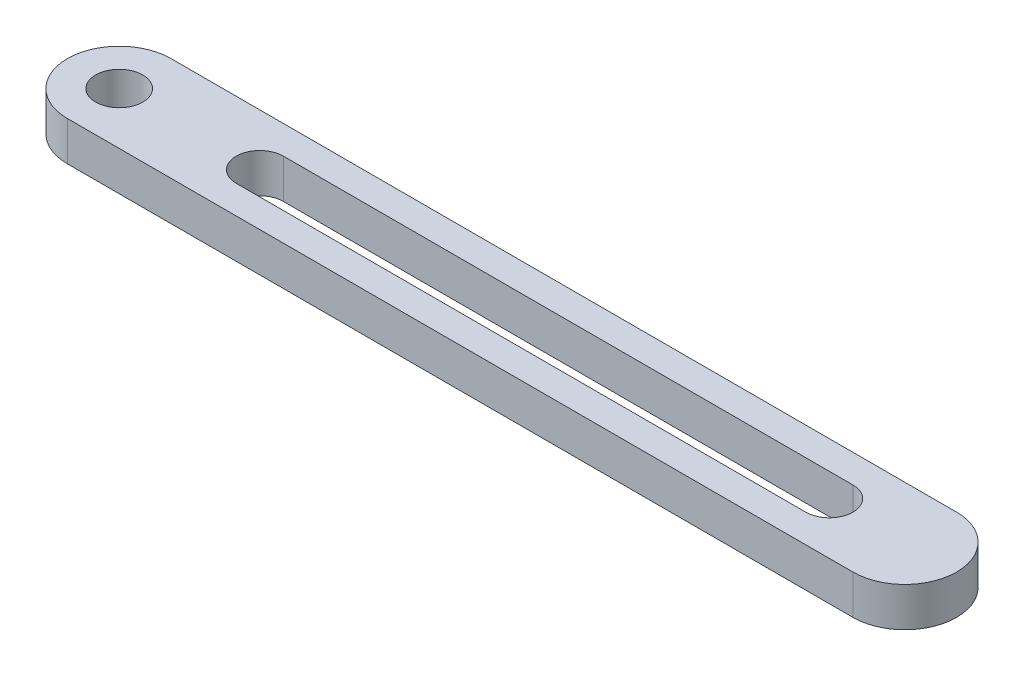
ISO-10303-21;
HEADER;
FILE_DESCRIPTION(('STEP AP214'),'2;1');
FILE_NAME('part.step','',(''),(''),'','','');
FILE_SCHEMA(('AUTOMOTIVE_DESIGN { 1 0 10303 214 1 1 1 1 }'));
ENDSEC;
DATA;
#1=APPLICATION_CONTEXT('core data for automotive mechanical design processes');
#2=APPLICATION_PROTOCOL_DEFINITION('international standard','automotive_design',2000,#1);
#3=PRODUCT_CONTEXT('',#1,'mechanical');
#4=PRODUCT('Part','Part','',(#3));
#5=PRODUCT_RELATED_PRODUCT_CATEGORY('part','',(#4));
#6=PRODUCT_DEFINITION_FORMATION('','',#4);
#7=PRODUCT_DEFINITION_CONTEXT('part definition',#1,'design');
#8=PRODUCT_DEFINITION('design','',#6,#7);
#9=PRODUCT_DEFINITION_SHAPE('','',#8);
#10=(LENGTH_UNIT() NAMED_UNIT(*) SI_UNIT(.MILLI.,.METRE.));
#11=(NAMED_UNIT(*) PLANE_ANGLE_UNIT() SI_UNIT($,.RADIAN.));
#12=(NAMED_UNIT(*) SI_UNIT($,.STERADIAN.) SOLID_ANGLE_UNIT());
#13=UNCERTAINTY_MEASURE_WITH_UNIT(LENGTH_MEASURE(1.E-05),#10,'distance_accuracy_value','');
#14=(GEOMETRIC_REPRESENTATION_CONTEXT(3) GLOBAL_UNCERTAINTY_ASSIGNED_CONTEXT((#13)) GLOBAL_UNIT_ASSIGNED_CONTEXT((#10,
#11,#12)) REPRESENTATION_CONTEXT('',''));
#15=CARTESIAN_POINT('',(0.,0.,0.));
#16=DIRECTION('',(0.,0.,1.));
#17=DIRECTION('',(1.,0.,0.));
#18=AXIS2_PLACEMENT_3D('',#15,#16,#17);
#19=CARTESIAN_POINT('',(0.,12.7,0.));
#20=DIRECTION('',(0.,1.,0.));
#21=DIRECTION('',(0.,0.,1.));
#22=AXIS2_PLACEMENT_3D('',#19,#20,#21);
#23=PLANE('',#22);
#24=CARTESIAN_POINT('',(0.,12.7,0.));
#25=DIRECTION('',(0.,1.,0.));
#26=DIRECTION('',(0.,0.,1.));
#27=AXIS2_PLACEMENT_3D('',#24,#25,#26);
#28=CIRCLE('',#27,7.62);
#29=CARTESIAN_POINT('',(0.,12.7,7.62));
#30=VERTEX_POINT('',#29);
#31=EDGE_CURVE('E141',#30,#30,#28,.T.);
#32=ORIENTED_EDGE('',*,*,#31,.F.);
#33=EDGE_LOOP('',(#32));
#34=FACE_BOUND('',#33,.T.);
#35=DIRECTION('',(1.,0.,0.));
#36=VECTOR('',#35,1.);
#37=CARTESIAN_POINT('',(0.,12.7,16.764));
#38=LINE('',#37,#36);
#39=CARTESIAN_POINT('',(0.,12.7,16.764));
#40=VERTEX_POINT('',#39);
#41=CARTESIAN_POINT('',(254.,12.7,16.764));
#42=VERTEX_POINT('',#41);
#43=EDGE_CURVE('E145',#40,#42,#38,.T.);
#44=ORIENTED_EDGE('',*,*,#43,.T.);
#45=CARTESIAN_POINT('',(254.,12.7,0.));
#46=DIRECTION('',(0.,1.,0.));
#47=DIRECTION('',(0.,0.,1.));
#48=AXIS2_PLACEMENT_3D('',#45,#46,#47);
#49=CIRCLE('',#48,16.764);
#50=CARTESIAN_POINT('',(254.,12.7,-16.764));
#51=VERTEX_POINT('',#50);
#52=EDGE_CURVE('E150',#42,#51,#49,.T.);
#53=ORIENTED_EDGE('',*,*,#52,.T.);
#54=DIRECTION('',(1.,0.,0.));
#55=VECTOR('',#54,1.);
#56=CARTESIAN_POINT('',(0.,12.7,-16.764));
#57=LINE('',#56,#55);
#58=CARTESIAN_POINT('',(0.,12.7,-16.764));
#59=VERTEX_POINT('',#58);
#60=EDGE_CURVE('E153',#59,#51,#57,.T.);
#61=ORIENTED_EDGE('',*,*,#60,.F.);
#62=CARTESIAN_POINT('',(0.,12.7,0.));
#63=DIRECTION('',(0.,1.,0.));
#64=DIRECTION('',(0.,0.,1.));
#65=AXIS2_PLACEMENT_3D('',#62,#63,#64);
#66=CIRCLE('',#65,16.764);
#67=EDGE_CURVE('E157',#59,#40,#66,.T.);
#68=ORIENTED_EDGE('',*,*,#67,.T.);
#69=EDGE_LOOP('',(#44,#53,#61,#68));
#70=FACE_BOUND('',#69,.T.);
#71=CARTESIAN_POINT('',(45.466,12.7,0.));
#72=DIRECTION('',(0.,1.,0.));
#73=DIRECTION('',(0.,0.,1.));
#74=AXIS2_PLACEMENT_3D('',#71,#72,#73);
#75=CIRCLE('',#74,7.62);
#76=CARTESIAN_POINT('',(45.466,12.7,-7.62));
#77=VERTEX_POINT('',#76);
#78=CARTESIAN_POINT('',(45.466,12.7,7.62));
#79=VERTEX_POINT('',#78);
#80=EDGE_CURVE('E126',#77,#79,#75,.T.);
#81=ORIENTED_EDGE('',*,*,#80,.F.);
#82=DIRECTION('',(1.,0.,0.));
#83=VECTOR('',#82,1.);
#84=CARTESIAN_POINT('',(167.898503033925,12.7,-7.61999999999999));
#85=LINE('',#84,#83);
#86=CARTESIAN_POINT('',(229.616,12.7,-7.61999999999999));
#87=VERTEX_POINT('',#86);
#88=EDGE_CURVE('E57',#77,#87,#85,.T.);
#89=ORIENTED_EDGE('',*,*,#88,.T.);
#90=CARTESIAN_POINT('',(229.616,12.7,0.));
#91=DIRECTION('',(0.,1.,0.));
#92=DIRECTION('',(0.,0.,1.));
#93=AXIS2_PLACEMENT_3D('',#90,#91,#92);
#94=CIRCLE('',#93,7.61999999999999);
#95=CARTESIAN_POINT('',(229.616,12.7,7.62));
#96=VERTEX_POINT('',#95);
#97=EDGE_CURVE('E116',#96,#87,#94,.T.);
#98=ORIENTED_EDGE('',*,*,#97,.F.);
#99=DIRECTION('',(1.,0.,0.));
#100=VECTOR('',#99,1.);
#101=CARTESIAN_POINT('',(45.466,12.7,7.62));
#102=LINE('',#101,#100);
#103=EDGE_CURVE('E123',#79,#96,#102,.T.);
#104=ORIENTED_EDGE('',*,*,#103,.F.);
#105=EDGE_LOOP('',(#81,#89,#98,#104));
#106=FACE_BOUND('',#105,.T.);
#107=ADVANCED_FACE('F41',(#34,#70,#106),#23,.T.);
#108=CARTESIAN_POINT('',(0.,0.,0.));
#109=DIRECTION('',(0.,1.,0.));
#110=DIRECTION('',(0.,0.,1.));
#111=AXIS2_PLACEMENT_3D('',#108,#109,#110);
#112=PLANE('',#111);
#113=DIRECTION('',(1.,0.,0.));
#114=VECTOR('',#113,1.);
#115=CARTESIAN_POINT('',(0.,0.,16.764));
#116=LINE('',#115,#114);
#117=CARTESIAN_POINT('',(0.,0.,16.764));
#118=VERTEX_POINT('',#117);
#119=CARTESIAN_POINT('',(254.,0.,16.764));
#120=VERTEX_POINT('',#119);
#121=EDGE_CURVE('E164',#118,#120,#116,.T.);
#122=ORIENTED_EDGE('',*,*,#121,.F.);
#123=CARTESIAN_POINT('',(0.,0.,0.));
#124=DIRECTION('',(0.,1.,0.));
#125=DIRECTION('',(0.,0.,1.));
#126=AXIS2_PLACEMENT_3D('',#123,#124,#125);
#127=CIRCLE('',#126,16.764);
#128=CARTESIAN_POINT('',(0.,0.,-16.764));
#129=VERTEX_POINT('',#128);
#130=EDGE_CURVE('E146',#129,#118,#127,.T.);
#131=ORIENTED_EDGE('',*,*,#130,.F.);
#132=DIRECTION('',(1.,0.,0.));
#133=VECTOR('',#132,1.);
#134=CARTESIAN_POINT('',(0.,0.,-16.764));
#135=LINE('',#134,#133);
#136=CARTESIAN_POINT('',(254.,0.,-16.764));
#137=VERTEX_POINT('',#136);
#138=EDGE_CURVE('E172',#129,#137,#135,.T.);
#139=ORIENTED_EDGE('',*,*,#138,.T.);
#140=CARTESIAN_POINT('',(254.,0.,0.));
#141=DIRECTION('',(0.,1.,0.));
#142=DIRECTION('',(0.,0.,1.));
#143=AXIS2_PLACEMENT_3D('',#140,#141,#142);
#144=CIRCLE('',#143,16.764);
#145=EDGE_CURVE('E168',#120,#137,#144,.T.);
#146=ORIENTED_EDGE('',*,*,#145,.F.);
#147=EDGE_LOOP('',(#122,#131,#139,#146));
#148=FACE_BOUND('',#147,.T.);
#149=CARTESIAN_POINT('',(0.,0.,0.));
#150=DIRECTION('',(0.,1.,0.));
#151=DIRECTION('',(0.,0.,1.));
#152=AXIS2_PLACEMENT_3D('',#149,#150,#151);
#153=CIRCLE('',#152,7.62);
#154=CARTESIAN_POINT('',(0.,0.,7.62));
#155=VERTEX_POINT('',#154);
#156=EDGE_CURVE('E112',#155,#155,#153,.T.);
#157=ORIENTED_EDGE('',*,*,#156,.T.);
#158=EDGE_LOOP('',(#157));
#159=FACE_BOUND('',#158,.T.);
#160=DIRECTION('',(1.,0.,0.));
#161=VECTOR('',#160,1.);
#162=CARTESIAN_POINT('',(0.,0.,-7.61999999999999));
#163=LINE('',#162,#161);
#164=CARTESIAN_POINT('',(45.466,0.,-7.62));
#165=VERTEX_POINT('',#164);
#166=CARTESIAN_POINT('',(229.616,0.,-7.61999999999999));
#167=VERTEX_POINT('',#166);
#168=EDGE_CURVE('E11',#165,#167,#163,.T.);
#169=ORIENTED_EDGE('',*,*,#168,.F.);
#170=CARTESIAN_POINT('',(45.466,0.,0.));
#171=DIRECTION('',(0.,1.,0.));
#172=DIRECTION('',(0.,0.,1.));
#173=AXIS2_PLACEMENT_3D('',#170,#171,#172);
#174=CIRCLE('',#173,7.62);
#175=CARTESIAN_POINT('',(45.466,0.,7.62));
#176=VERTEX_POINT('',#175);
#177=EDGE_CURVE('E191',#165,#176,#174,.T.);
#178=ORIENTED_EDGE('',*,*,#177,.T.);
#179=DIRECTION('',(1.,0.,0.));
#180=VECTOR('',#179,1.);
#181=CARTESIAN_POINT('',(0.,0.,7.62));
#182=LINE('',#181,#180);
#183=CARTESIAN_POINT('',(229.616,0.,7.62));
#184=VERTEX_POINT('',#183);
#185=EDGE_CURVE('E195',#176,#184,#182,.T.);
#186=ORIENTED_EDGE('',*,*,#185,.T.);
#187=CARTESIAN_POINT('',(229.616,0.,0.));
#188=DIRECTION('',(0.,1.,0.));
#189=DIRECTION('',(0.,0.,1.));
#190=AXIS2_PLACEMENT_3D('',#187,#188,#189);
#191=CIRCLE('',#190,7.61999999999999);
#192=EDGE_CURVE('E50',#184,#167,#191,.T.);
#193=ORIENTED_EDGE('',*,*,#192,.T.);
#194=EDGE_LOOP('',(#169,#178,#186,#193));
#195=FACE_BOUND('',#194,.T.);
#196=ADVANCED_FACE('F200',(#148,#159,#195),#112,.F.);
#197=CARTESIAN_POINT('',(0.,12.7,16.764));
#198=DIRECTION('',(0.,0.,-1.));
#199=DIRECTION('',(-1.,0.,0.));
#200=AXIS2_PLACEMENT_3D('',#197,#198,#199);
#201=PLANE('',#200);
#202=ORIENTED_EDGE('',*,*,#121,.T.);
#203=DIRECTION('',(0.,-1.,0.));
#204=VECTOR('',#203,1.);
#205=CARTESIAN_POINT('',(254.,12.7,16.764));
#206=LINE('',#205,#204);
#207=EDGE_CURVE('E187',#42,#120,#206,.T.);
#208=ORIENTED_EDGE('',*,*,#207,.F.);
#209=ORIENTED_EDGE('',*,*,#43,.F.);
#210=DIRECTION('',(0.,-1.,0.));
#211=VECTOR('',#210,1.);
#212=CARTESIAN_POINT('',(0.,12.7,16.764));
#213=LINE('',#212,#211);
#214=EDGE_CURVE('E160',#40,#118,#213,.T.);
#215=ORIENTED_EDGE('',*,*,#214,.T.);
#216=EDGE_LOOP('',(#202,#208,#209,#215));
#217=FACE_BOUND('',#216,.T.);
#218=ADVANCED_FACE('F216',(#217),#201,.F.);
#219=CARTESIAN_POINT('',(254.,12.7,0.));
#220=DIRECTION('',(0.,-1.,0.));
#221=DIRECTION('',(0.,0.,-1.));
#222=AXIS2_PLACEMENT_3D('',#219,#220,#221);
#223=CYLINDRICAL_SURFACE('',#222,16.764);
#224=ORIENTED_EDGE('',*,*,#145,.T.);
#225=DIRECTION('',(0.,-1.,0.));
#226=VECTOR('',#225,1.);
#227=CARTESIAN_POINT('',(254.,12.7,-16.764));
#228=LINE('',#227,#226);
#229=EDGE_CURVE('E184',#51,#137,#228,.T.);
#230=ORIENTED_EDGE('',*,*,#229,.F.);
#231=ORIENTED_EDGE('',*,*,#52,.F.);
#232=ORIENTED_EDGE('',*,*,#207,.T.);
#233=EDGE_LOOP('',(#224,#230,#231,#232));
#234=FACE_BOUND('',#233,.T.);
#235=ADVANCED_FACE('F231',(#234),#223,.T.);
#236=CARTESIAN_POINT('',(0.,12.7,-16.764));
#237=DIRECTION('',(0.,0.,-1.));
#238=DIRECTION('',(-1.,0.,0.));
#239=AXIS2_PLACEMENT_3D('',#236,#237,#238);
#240=PLANE('',#239);
#241=ORIENTED_EDGE('',*,*,#138,.F.);
#242=DIRECTION('',(0.,-1.,0.));
#243=VECTOR('',#242,1.);
#244=CARTESIAN_POINT('',(0.,12.7,-16.764));
#245=LINE('',#244,#243);
#246=EDGE_CURVE('E181',#59,#129,#245,.T.);
#247=ORIENTED_EDGE('',*,*,#246,.F.);
#248=ORIENTED_EDGE('',*,*,#60,.T.);
#249=ORIENTED_EDGE('',*,*,#229,.T.);
#250=EDGE_LOOP('',(#241,#247,#248,#249));
#251=FACE_BOUND('',#250,.T.);
#252=ADVANCED_FACE('F228',(#251),#240,.T.);
#253=CARTESIAN_POINT('',(0.,12.7,0.));
#254=DIRECTION('',(0.,-1.,0.));
#255=DIRECTION('',(0.,0.,-1.));
#256=AXIS2_PLACEMENT_3D('',#253,#254,#255);
#257=CYLINDRICAL_SURFACE('',#256,7.62);
#258=ORIENTED_EDGE('',*,*,#31,.T.);
#259=EDGE_LOOP('',(#258));
#260=FACE_BOUND('',#259,.T.);
#261=ORIENTED_EDGE('',*,*,#156,.F.);
#262=EDGE_LOOP('',(#261));
#263=FACE_BOUND('',#262,.T.);
#264=ADVANCED_FACE('F43',(#260,#263),#257,.F.);
#265=CARTESIAN_POINT('',(0.,12.7,0.));
#266=DIRECTION('',(0.,-1.,0.));
#267=DIRECTION('',(0.,0.,-1.));
#268=AXIS2_PLACEMENT_3D('',#265,#266,#267);
#269=CYLINDRICAL_SURFACE('',#268,16.764);
#270=ORIENTED_EDGE('',*,*,#130,.T.);
#271=ORIENTED_EDGE('',*,*,#214,.F.);
#272=ORIENTED_EDGE('',*,*,#67,.F.);
#273=ORIENTED_EDGE('',*,*,#246,.T.);
#274=EDGE_LOOP('',(#270,#271,#272,#273));
#275=FACE_BOUND('',#274,.T.);
#276=ADVANCED_FACE('F224',(#275),#269,.T.);
#277=CARTESIAN_POINT('',(167.898503033925,-33.274,-7.61999999999999));
#278=DIRECTION('',(0.,0.,1.));
#279=DIRECTION('',(1.,0.,0.));
#280=AXIS2_PLACEMENT_3D('',#277,#278,#279);
#281=PLANE('',#280);
#282=ORIENTED_EDGE('',*,*,#168,.T.);
#283=DIRECTION('',(0.,1.,0.));
#284=VECTOR('',#283,1.);
#285=CARTESIAN_POINT('',(229.616,-33.274,-7.61999999999999));
#286=LINE('',#285,#284);
#287=EDGE_CURVE('E105',#167,#87,#286,.T.);
#288=ORIENTED_EDGE('',*,*,#287,.T.);
#289=ORIENTED_EDGE('',*,*,#88,.F.);
#290=DIRECTION('',(0.,1.,0.));
#291=VECTOR('',#290,1.);
#292=CARTESIAN_POINT('',(45.466,-33.274,-7.62));
#293=LINE('',#292,#291);
#294=EDGE_CURVE('E134',#165,#77,#293,.T.);
#295=ORIENTED_EDGE('',*,*,#294,.F.);
#296=EDGE_LOOP('',(#282,#288,#289,#295));
#297=FACE_BOUND('',#296,.T.);
#298=ADVANCED_FACE('F107',(#297),#281,.T.);
#299=CARTESIAN_POINT('',(229.616,-33.274,0.));
#300=DIRECTION('',(0.,1.,0.));
#301=DIRECTION('',(0.,0.,1.));
#302=AXIS2_PLACEMENT_3D('',#299,#300,#301);
#303=CYLINDRICAL_SURFACE('',#302,7.61999999999999);
#304=DIRECTION('',(0.,1.,0.));
#305=VECTOR('',#304,1.);
#306=CARTESIAN_POINT('',(229.616,-33.274,7.62));
#307=LINE('',#306,#305);
#308=EDGE_CURVE('E113',#184,#96,#307,.T.);
#309=ORIENTED_EDGE('',*,*,#308,.T.);
#310=ORIENTED_EDGE('',*,*,#97,.T.);
#311=ORIENTED_EDGE('',*,*,#287,.F.);
#312=ORIENTED_EDGE('',*,*,#192,.F.);
#313=EDGE_LOOP('',(#309,#310,#311,#312));
#314=FACE_BOUND('',#313,.T.);
#315=ADVANCED_FACE('F117',(#314),#303,.F.);
#316=CARTESIAN_POINT('',(45.466,-33.274,7.62));
#317=DIRECTION('',(0.,0.,1.));
#318=DIRECTION('',(1.,0.,0.));
#319=AXIS2_PLACEMENT_3D('',#316,#317,#318);
#320=PLANE('',#319);
#321=DIRECTION('',(0.,1.,0.));
#322=VECTOR('',#321,1.);
#323=CARTESIAN_POINT('',(45.466,-33.274,7.62));
#324=LINE('',#323,#322);
#325=EDGE_CURVE('E65',#176,#79,#324,.T.);
#326=ORIENTED_EDGE('',*,*,#325,.T.);
#327=ORIENTED_EDGE('',*,*,#103,.T.);
#328=ORIENTED_EDGE('',*,*,#308,.F.);
#329=ORIENTED_EDGE('',*,*,#185,.F.);
#330=EDGE_LOOP('',(#326,#327,#328,#329));
#331=FACE_BOUND('',#330,.T.);
#332=ADVANCED_FACE('F202',(#331),#320,.F.);
#333=CARTESIAN_POINT('',(45.466,-33.274,0.));
#334=DIRECTION('',(0.,1.,0.));
#335=DIRECTION('',(0.,0.,1.));
#336=AXIS2_PLACEMENT_3D('',#333,#334,#335);
#337=CYLINDRICAL_SURFACE('',#336,7.62);
#338=ORIENTED_EDGE('',*,*,#294,.T.);
#339=ORIENTED_EDGE('',*,*,#80,.T.);
#340=ORIENTED_EDGE('',*,*,#325,.F.);
#341=ORIENTED_EDGE('',*,*,#177,.F.);
#342=EDGE_LOOP('',(#338,#339,#340,#341));
#343=FACE_BOUND('',#342,.T.);
#344=ADVANCED_FACE('F203',(#343),#337,.F.);
#345=CLOSED_SHELL('',(#107,#196,#218,#235,#252,#264,#276,#298,#315,#332,#344));
#346=MANIFOLD_SOLID_BREP('B2',#345);
#347=ADVANCED_BREP_SHAPE_REPRESENTATION('',(#18,#346),#14);
#348=SHAPE_DEFINITION_REPRESENTATION(#9,#347);
ENDSEC;
END-ISO-10303-21;
